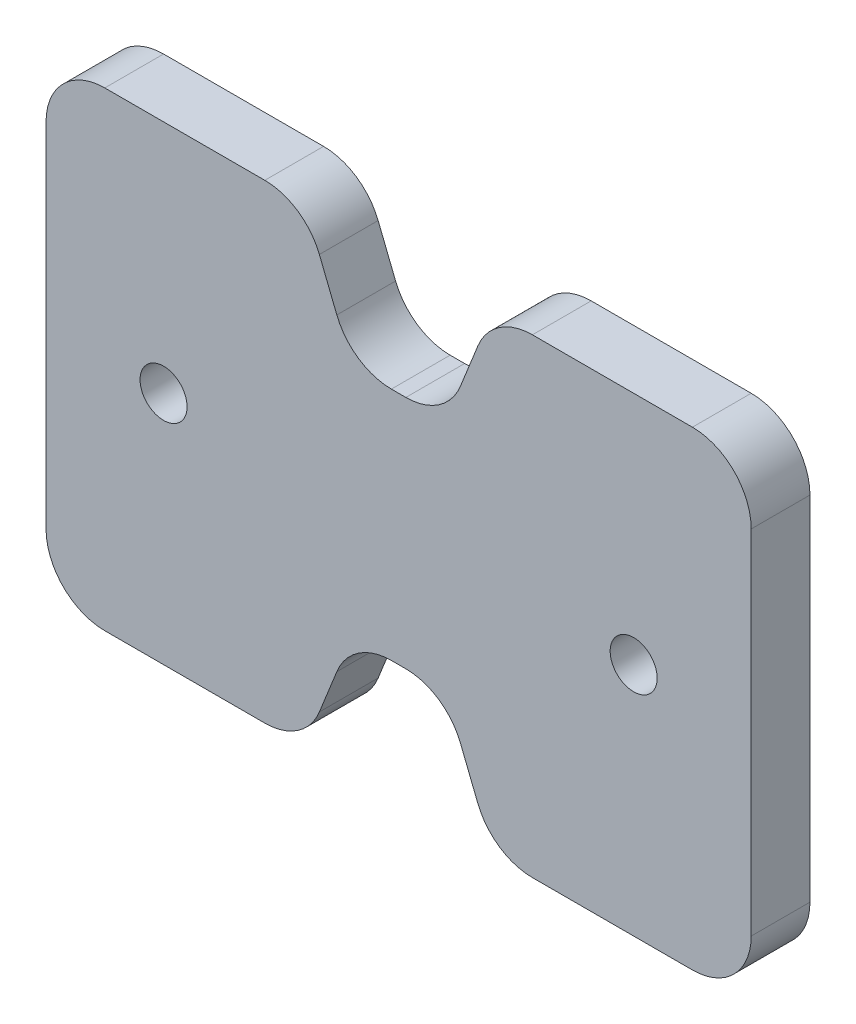
ISO-10303-21;
HEADER;
FILE_DESCRIPTION(('STEP AP214'),'2;1');
FILE_NAME('part.step','',(''),(''),'','','');
FILE_SCHEMA(('AUTOMOTIVE_DESIGN { 1 0 10303 214 1 1 1 1 }'));
ENDSEC;
DATA;
#1=APPLICATION_CONTEXT('core data for automotive mechanical design processes');
#2=APPLICATION_PROTOCOL_DEFINITION('international standard','automotive_design',2000,#1);
#3=PRODUCT_CONTEXT('',#1,'mechanical');
#4=PRODUCT('Part','Part','',(#3));
#5=PRODUCT_RELATED_PRODUCT_CATEGORY('part','',(#4));
#6=PRODUCT_DEFINITION_FORMATION('','',#4);
#7=PRODUCT_DEFINITION_CONTEXT('part definition',#1,'design');
#8=PRODUCT_DEFINITION('design','',#6,#7);
#9=PRODUCT_DEFINITION_SHAPE('','',#8);
#10=(LENGTH_UNIT() NAMED_UNIT(*) SI_UNIT(.MILLI.,.METRE.));
#11=(NAMED_UNIT(*) PLANE_ANGLE_UNIT() SI_UNIT($,.RADIAN.));
#12=(NAMED_UNIT(*) SI_UNIT($,.STERADIAN.) SOLID_ANGLE_UNIT());
#13=UNCERTAINTY_MEASURE_WITH_UNIT(LENGTH_MEASURE(1.E-05),#10,'distance_accuracy_value','');
#14=(GEOMETRIC_REPRESENTATION_CONTEXT(3) GLOBAL_UNCERTAINTY_ASSIGNED_CONTEXT((#13)) GLOBAL_UNIT_ASSIGNED_CONTEXT((#10,
#11,#12)) REPRESENTATION_CONTEXT('',''));
#15=CARTESIAN_POINT('',(0.,0.,0.));
#16=DIRECTION('',(0.,0.,1.));
#17=DIRECTION('',(1.,0.,0.));
#18=AXIS2_PLACEMENT_3D('',#15,#16,#17);
#19=CARTESIAN_POINT('',(0.,0.,5.));
#20=DIRECTION('',(0.,0.,1.));
#21=DIRECTION('',(1.,0.,0.));
#22=AXIS2_PLACEMENT_3D('',#19,#20,#21);
#23=PLANE('',#22);
#24=CARTESIAN_POINT('',(-20.,0.,5.));
#25=DIRECTION('',(0.,0.,1.));
#26=DIRECTION('',(-1.,0.,0.));
#27=AXIS2_PLACEMENT_3D('',#24,#25,#26);
#28=CIRCLE('',#27,2.);
#29=CARTESIAN_POINT('',(-22.,0.,5.));
#30=VERTEX_POINT('',#29);
#31=EDGE_CURVE('E354',#30,#30,#28,.T.);
#32=ORIENTED_EDGE('',*,*,#31,.F.);
#33=EDGE_LOOP('',(#32));
#34=FACE_BOUND('',#33,.T.);
#35=DIRECTION('',(1.,0.,0.));
#36=VECTOR('',#35,1.);
#37=CARTESIAN_POINT('',(8.,-20.,5.));
#38=LINE('',#37,#36);
#39=CARTESIAN_POINT('',(11.3851648071345,-20.,5.));
#40=VERTEX_POINT('',#39);
#41=CARTESIAN_POINT('',(25.,-20.,5.));
#42=VERTEX_POINT('',#41);
#43=EDGE_CURVE('E380',#40,#42,#38,.T.);
#44=ORIENTED_EDGE('',*,*,#43,.T.);
#45=CARTESIAN_POINT('',(25.,-15.,5.));
#46=DIRECTION('',(0.,0.,1.));
#47=DIRECTION('',(1.,0.,0.));
#48=AXIS2_PLACEMENT_3D('',#45,#46,#47);
#49=CIRCLE('',#48,5.);
#50=CARTESIAN_POINT('',(30.,-15.,5.));
#51=VERTEX_POINT('',#50);
#52=EDGE_CURVE('E270',#42,#51,#49,.T.);
#53=ORIENTED_EDGE('',*,*,#52,.T.);
#54=DIRECTION('',(0.,1.,0.));
#55=VECTOR('',#54,1.);
#56=CARTESIAN_POINT('',(30.,-20.,5.));
#57=LINE('',#56,#55);
#58=CARTESIAN_POINT('',(30.,15.,5.));
#59=VERTEX_POINT('',#58);
#60=EDGE_CURVE('E214',#51,#59,#57,.T.);
#61=ORIENTED_EDGE('',*,*,#60,.T.);
#62=CARTESIAN_POINT('',(25.,15.,5.));
#63=DIRECTION('',(0.,0.,1.));
#64=DIRECTION('',(1.,0.,0.));
#65=AXIS2_PLACEMENT_3D('',#62,#63,#64);
#66=CIRCLE('',#65,5.);
#67=CARTESIAN_POINT('',(25.,20.,5.));
#68=VERTEX_POINT('',#67);
#69=EDGE_CURVE('E256',#59,#68,#66,.T.);
#70=ORIENTED_EDGE('',*,*,#69,.T.);
#71=DIRECTION('',(-1.,0.,0.));
#72=VECTOR('',#71,1.);
#73=CARTESIAN_POINT('',(30.,20.,5.));
#74=LINE('',#73,#72);
#75=CARTESIAN_POINT('',(11.3851648071345,20.,5.));
#76=VERTEX_POINT('',#75);
#77=EDGE_CURVE('E385',#68,#76,#74,.T.);
#78=ORIENTED_EDGE('',*,*,#77,.T.);
#79=CARTESIAN_POINT('',(11.3851648071345,15.,5.));
#80=DIRECTION('',(0.,0.,1.));
#81=DIRECTION('',(1.,0.,0.));
#82=AXIS2_PLACEMENT_3D('',#79,#80,#81);
#83=CIRCLE('',#82,5.);
#84=CARTESIAN_POINT('',(6.74278135270821,16.8569533817705,5.));
#85=VERTEX_POINT('',#84);
#86=EDGE_CURVE('E262',#76,#85,#83,.T.);
#87=ORIENTED_EDGE('',*,*,#86,.T.);
#88=DIRECTION('',(-0.371390676354104,-0.928476690885259,0.));
#89=VECTOR('',#88,1.);
#90=CARTESIAN_POINT('',(8.,20.,5.));
#91=LINE('',#90,#89);
#92=CARTESIAN_POINT('',(5.25721864729179,13.1430466182295,5.));
#93=VERTEX_POINT('',#92);
#94=EDGE_CURVE('E346',#85,#93,#91,.T.);
#95=ORIENTED_EDGE('',*,*,#94,.T.);
#96=CARTESIAN_POINT('',(0.614835192865495,15.,5.));
#97=DIRECTION('',(0.,0.,1.));
#98=DIRECTION('',(1.,0.,0.));
#99=AXIS2_PLACEMENT_3D('',#96,#97,#98);
#100=CIRCLE('',#99,5.);
#101=CARTESIAN_POINT('',(0.614835192865495,10.,5.));
#102=VERTEX_POINT('',#101);
#103=EDGE_CURVE('E331',#93,#102,#100,.F.);
#104=ORIENTED_EDGE('',*,*,#103,.T.);
#105=DIRECTION('',(-1.,0.,0.));
#106=VECTOR('',#105,1.);
#107=CARTESIAN_POINT('',(4.,10.,5.));
#108=LINE('',#107,#106);
#109=CARTESIAN_POINT('',(-0.614835192865495,10.,5.));
#110=VERTEX_POINT('',#109);
#111=EDGE_CURVE('E344',#102,#110,#108,.T.);
#112=ORIENTED_EDGE('',*,*,#111,.T.);
#113=CARTESIAN_POINT('',(-0.614835192865495,15.,5.));
#114=DIRECTION('',(0.,0.,1.));
#115=DIRECTION('',(1.,0.,0.));
#116=AXIS2_PLACEMENT_3D('',#113,#114,#115);
#117=CIRCLE('',#116,5.);
#118=CARTESIAN_POINT('',(-5.25721864729179,13.1430466182295,5.));
#119=VERTEX_POINT('',#118);
#120=EDGE_CURVE('E11',#110,#119,#117,.F.);
#121=ORIENTED_EDGE('',*,*,#120,.T.);
#122=DIRECTION('',(-0.371390676354104,0.928476690885259,0.));
#123=VECTOR('',#122,1.);
#124=CARTESIAN_POINT('',(-4.,10.,5.));
#125=LINE('',#124,#123);
#126=CARTESIAN_POINT('',(-6.74278135270821,16.8569533817705,5.));
#127=VERTEX_POINT('',#126);
#128=EDGE_CURVE('E239',#119,#127,#125,.T.);
#129=ORIENTED_EDGE('',*,*,#128,.T.);
#130=CARTESIAN_POINT('',(-11.3851648071345,15.,5.));
#131=DIRECTION('',(0.,0.,1.));
#132=DIRECTION('',(1.,0.,0.));
#133=AXIS2_PLACEMENT_3D('',#130,#131,#132);
#134=CIRCLE('',#133,5.);
#135=CARTESIAN_POINT('',(-11.3851648071345,20.,5.));
#136=VERTEX_POINT('',#135);
#137=EDGE_CURVE('E260',#127,#136,#134,.T.);
#138=ORIENTED_EDGE('',*,*,#137,.T.);
#139=DIRECTION('',(-1.,0.,0.));
#140=VECTOR('',#139,1.);
#141=CARTESIAN_POINT('',(-8.,20.,5.));
#142=LINE('',#141,#140);
#143=CARTESIAN_POINT('',(-25.,20.,5.));
#144=VERTEX_POINT('',#143);
#145=EDGE_CURVE('E238',#136,#144,#142,.T.);
#146=ORIENTED_EDGE('',*,*,#145,.T.);
#147=CARTESIAN_POINT('',(-25.,15.,5.));
#148=DIRECTION('',(0.,0.,1.));
#149=DIRECTION('',(1.,0.,0.));
#150=AXIS2_PLACEMENT_3D('',#147,#148,#149);
#151=CIRCLE('',#150,5.);
#152=CARTESIAN_POINT('',(-30.,15.,5.));
#153=VERTEX_POINT('',#152);
#154=EDGE_CURVE('E258',#144,#153,#151,.T.);
#155=ORIENTED_EDGE('',*,*,#154,.T.);
#156=DIRECTION('',(0.,-1.,0.));
#157=VECTOR('',#156,1.);
#158=CARTESIAN_POINT('',(-30.,20.,5.));
#159=LINE('',#158,#157);
#160=CARTESIAN_POINT('',(-30.,-15.,5.));
#161=VERTEX_POINT('',#160);
#162=EDGE_CURVE('E502',#153,#161,#159,.T.);
#163=ORIENTED_EDGE('',*,*,#162,.T.);
#164=CARTESIAN_POINT('',(-25.,-15.,5.));
#165=DIRECTION('',(0.,0.,1.));
#166=DIRECTION('',(1.,0.,0.));
#167=AXIS2_PLACEMENT_3D('',#164,#165,#166);
#168=CIRCLE('',#167,5.);
#169=CARTESIAN_POINT('',(-25.,-20.,5.));
#170=VERTEX_POINT('',#169);
#171=EDGE_CURVE('E266',#161,#170,#168,.T.);
#172=ORIENTED_EDGE('',*,*,#171,.T.);
#173=DIRECTION('',(1.,0.,0.));
#174=VECTOR('',#173,1.);
#175=CARTESIAN_POINT('',(-30.,-20.,5.));
#176=LINE('',#175,#174);
#177=CARTESIAN_POINT('',(-11.3851648071345,-20.,5.));
#178=VERTEX_POINT('',#177);
#179=EDGE_CURVE('E505',#170,#178,#176,.T.);
#180=ORIENTED_EDGE('',*,*,#179,.T.);
#181=CARTESIAN_POINT('',(-11.3851648071345,-15.,5.));
#182=DIRECTION('',(0.,0.,1.));
#183=DIRECTION('',(1.,0.,0.));
#184=AXIS2_PLACEMENT_3D('',#181,#182,#183);
#185=CIRCLE('',#184,5.);
#186=CARTESIAN_POINT('',(-6.74278135270821,-16.8569533817705,5.));
#187=VERTEX_POINT('',#186);
#188=EDGE_CURVE('E264',#178,#187,#185,.T.);
#189=ORIENTED_EDGE('',*,*,#188,.T.);
#190=DIRECTION('',(0.371390676354104,0.928476690885259,0.));
#191=VECTOR('',#190,1.);
#192=CARTESIAN_POINT('',(-8.,-20.,5.));
#193=LINE('',#192,#191);
#194=CARTESIAN_POINT('',(-5.25721864729179,-13.1430466182295,5.));
#195=VERTEX_POINT('',#194);
#196=EDGE_CURVE('E513',#187,#195,#193,.T.);
#197=ORIENTED_EDGE('',*,*,#196,.T.);
#198=CARTESIAN_POINT('',(-0.614835192865493,-15.,5.));
#199=DIRECTION('',(0.,0.,1.));
#200=DIRECTION('',(1.,0.,0.));
#201=AXIS2_PLACEMENT_3D('',#198,#199,#200);
#202=CIRCLE('',#201,5.);
#203=CARTESIAN_POINT('',(-0.614835192865495,-10.,5.));
#204=VERTEX_POINT('',#203);
#205=EDGE_CURVE('E323',#195,#204,#202,.F.);
#206=ORIENTED_EDGE('',*,*,#205,.T.);
#207=DIRECTION('',(1.,0.,0.));
#208=VECTOR('',#207,1.);
#209=CARTESIAN_POINT('',(-4.,-10.,5.));
#210=LINE('',#209,#208);
#211=CARTESIAN_POINT('',(0.614835192865493,-10.,5.));
#212=VERTEX_POINT('',#211);
#213=EDGE_CURVE('E387',#204,#212,#210,.T.);
#214=ORIENTED_EDGE('',*,*,#213,.T.);
#215=CARTESIAN_POINT('',(0.614835192865494,-15.,5.));
#216=DIRECTION('',(0.,0.,1.));
#217=DIRECTION('',(1.,0.,0.));
#218=AXIS2_PLACEMENT_3D('',#215,#216,#217);
#219=CIRCLE('',#218,5.);
#220=CARTESIAN_POINT('',(5.25721864729179,-13.1430466182295,5.));
#221=VERTEX_POINT('',#220);
#222=EDGE_CURVE('E327',#212,#221,#219,.F.);
#223=ORIENTED_EDGE('',*,*,#222,.T.);
#224=DIRECTION('',(0.371390676354104,-0.928476690885259,0.));
#225=VECTOR('',#224,1.);
#226=CARTESIAN_POINT('',(4.,-10.,5.));
#227=LINE('',#226,#225);
#228=CARTESIAN_POINT('',(6.74278135270821,-16.8569533817705,5.));
#229=VERTEX_POINT('',#228);
#230=EDGE_CURVE('E381',#221,#229,#227,.T.);
#231=ORIENTED_EDGE('',*,*,#230,.T.);
#232=CARTESIAN_POINT('',(11.3851648071345,-15.,5.));
#233=DIRECTION('',(0.,0.,1.));
#234=DIRECTION('',(1.,0.,0.));
#235=AXIS2_PLACEMENT_3D('',#232,#233,#234);
#236=CIRCLE('',#235,5.);
#237=EDGE_CURVE('E268',#229,#40,#236,.T.);
#238=ORIENTED_EDGE('',*,*,#237,.T.);
#239=EDGE_LOOP('',(#44,#53,#61,#70,#78,#87,#95,#104,#112,#121,#129,#138,#146,#155,#163,#172,
#180,#189,#197,#206,#214,#223,#231,#238));
#240=FACE_BOUND('',#239,.T.);
#241=CARTESIAN_POINT('',(20.,0.,5.));
#242=DIRECTION('',(0.,0.,1.));
#243=DIRECTION('',(1.,0.,0.));
#244=AXIS2_PLACEMENT_3D('',#241,#242,#243);
#245=CIRCLE('',#244,2.);
#246=CARTESIAN_POINT('',(22.,0.,5.));
#247=VERTEX_POINT('',#246);
#248=EDGE_CURVE('E537',#247,#247,#245,.T.);
#249=ORIENTED_EDGE('',*,*,#248,.F.);
#250=EDGE_LOOP('',(#249));
#251=FACE_BOUND('',#250,.T.);
#252=ADVANCED_FACE('F33',(#34,#240,#251),#23,.T.);
#253=CARTESIAN_POINT('',(0.,0.,0.));
#254=DIRECTION('',(0.,0.,1.));
#255=DIRECTION('',(1.,0.,0.));
#256=AXIS2_PLACEMENT_3D('',#253,#254,#255);
#257=PLANE('',#256);
#258=DIRECTION('',(0.,1.,0.));
#259=VECTOR('',#258,1.);
#260=CARTESIAN_POINT('',(30.,-20.,0.));
#261=LINE('',#260,#259);
#262=CARTESIAN_POINT('',(30.,-15.,0.));
#263=VERTEX_POINT('',#262);
#264=CARTESIAN_POINT('',(30.,15.,0.));
#265=VERTEX_POINT('',#264);
#266=EDGE_CURVE('E211',#263,#265,#261,.T.);
#267=ORIENTED_EDGE('',*,*,#266,.F.);
#268=CARTESIAN_POINT('',(25.,-15.,0.));
#269=DIRECTION('',(0.,0.,1.));
#270=DIRECTION('',(1.,0.,0.));
#271=AXIS2_PLACEMENT_3D('',#268,#269,#270);
#272=CIRCLE('',#271,5.);
#273=CARTESIAN_POINT('',(25.,-20.,0.));
#274=VERTEX_POINT('',#273);
#275=EDGE_CURVE('E194',#263,#274,#272,.F.);
#276=ORIENTED_EDGE('',*,*,#275,.T.);
#277=DIRECTION('',(1.,0.,0.));
#278=VECTOR('',#277,1.);
#279=CARTESIAN_POINT('',(8.,-20.,0.));
#280=LINE('',#279,#278);
#281=CARTESIAN_POINT('',(11.3851648071345,-20.,0.));
#282=VERTEX_POINT('',#281);
#283=EDGE_CURVE('E222',#282,#274,#280,.T.);
#284=ORIENTED_EDGE('',*,*,#283,.F.);
#285=CARTESIAN_POINT('',(11.3851648071345,-15.,0.));
#286=DIRECTION('',(0.,0.,1.));
#287=DIRECTION('',(1.,0.,0.));
#288=AXIS2_PLACEMENT_3D('',#285,#286,#287);
#289=CIRCLE('',#288,5.);
#290=CARTESIAN_POINT('',(6.74278135270821,-16.8569533817705,0.));
#291=VERTEX_POINT('',#290);
#292=EDGE_CURVE('E205',#282,#291,#289,.F.);
#293=ORIENTED_EDGE('',*,*,#292,.T.);
#294=DIRECTION('',(0.371390676354104,-0.928476690885259,0.));
#295=VECTOR('',#294,1.);
#296=CARTESIAN_POINT('',(4.,-10.,0.));
#297=LINE('',#296,#295);
#298=CARTESIAN_POINT('',(5.25721864729179,-13.1430466182295,0.));
#299=VERTEX_POINT('',#298);
#300=EDGE_CURVE('E227',#299,#291,#297,.T.);
#301=ORIENTED_EDGE('',*,*,#300,.F.);
#302=CARTESIAN_POINT('',(0.614835192865494,-15.,0.));
#303=DIRECTION('',(0.,0.,1.));
#304=DIRECTION('',(1.,0.,0.));
#305=AXIS2_PLACEMENT_3D('',#302,#303,#304);
#306=CIRCLE('',#305,5.);
#307=CARTESIAN_POINT('',(0.614835192865493,-10.,0.));
#308=VERTEX_POINT('',#307);
#309=EDGE_CURVE('E325',#299,#308,#306,.T.);
#310=ORIENTED_EDGE('',*,*,#309,.T.);
#311=DIRECTION('',(1.,0.,0.));
#312=VECTOR('',#311,1.);
#313=CARTESIAN_POINT('',(-4.,-10.,0.));
#314=LINE('',#313,#312);
#315=CARTESIAN_POINT('',(-0.614835192865495,-10.,0.));
#316=VERTEX_POINT('',#315);
#317=EDGE_CURVE('E363',#316,#308,#314,.T.);
#318=ORIENTED_EDGE('',*,*,#317,.F.);
#319=CARTESIAN_POINT('',(-0.614835192865493,-15.,0.));
#320=DIRECTION('',(0.,0.,1.));
#321=DIRECTION('',(1.,0.,0.));
#322=AXIS2_PLACEMENT_3D('',#319,#320,#321);
#323=CIRCLE('',#322,5.);
#324=CARTESIAN_POINT('',(-5.25721864729179,-13.1430466182295,0.));
#325=VERTEX_POINT('',#324);
#326=EDGE_CURVE('E321',#316,#325,#323,.T.);
#327=ORIENTED_EDGE('',*,*,#326,.T.);
#328=DIRECTION('',(0.371390676354104,0.928476690885259,0.));
#329=VECTOR('',#328,1.);
#330=CARTESIAN_POINT('',(-8.,-20.,0.));
#331=LINE('',#330,#329);
#332=CARTESIAN_POINT('',(-6.74278135270821,-16.8569533817705,0.));
#333=VERTEX_POINT('',#332);
#334=EDGE_CURVE('E360',#333,#325,#331,.T.);
#335=ORIENTED_EDGE('',*,*,#334,.F.);
#336=CARTESIAN_POINT('',(-11.3851648071345,-15.,0.));
#337=DIRECTION('',(0.,0.,1.));
#338=DIRECTION('',(1.,0.,0.));
#339=AXIS2_PLACEMENT_3D('',#336,#337,#338);
#340=CIRCLE('',#339,5.);
#341=CARTESIAN_POINT('',(-11.3851648071345,-20.,0.));
#342=VERTEX_POINT('',#341);
#343=EDGE_CURVE('E248',#333,#342,#340,.F.);
#344=ORIENTED_EDGE('',*,*,#343,.T.);
#345=DIRECTION('',(1.,0.,0.));
#346=VECTOR('',#345,1.);
#347=CARTESIAN_POINT('',(-30.,-20.,0.));
#348=LINE('',#347,#346);
#349=CARTESIAN_POINT('',(-25.,-20.,0.));
#350=VERTEX_POINT('',#349);
#351=EDGE_CURVE('E357',#350,#342,#348,.T.);
#352=ORIENTED_EDGE('',*,*,#351,.F.);
#353=CARTESIAN_POINT('',(-25.,-15.,0.));
#354=DIRECTION('',(0.,0.,1.));
#355=DIRECTION('',(1.,0.,0.));
#356=AXIS2_PLACEMENT_3D('',#353,#354,#355);
#357=CIRCLE('',#356,5.);
#358=CARTESIAN_POINT('',(-30.,-15.,0.));
#359=VERTEX_POINT('',#358);
#360=EDGE_CURVE('E250',#350,#359,#357,.F.);
#361=ORIENTED_EDGE('',*,*,#360,.T.);
#362=DIRECTION('',(0.,-1.,0.));
#363=VECTOR('',#362,1.);
#364=CARTESIAN_POINT('',(-30.,20.,0.));
#365=LINE('',#364,#363);
#366=CARTESIAN_POINT('',(-30.,15.,0.));
#367=VERTEX_POINT('',#366);
#368=EDGE_CURVE('E353',#367,#359,#365,.T.);
#369=ORIENTED_EDGE('',*,*,#368,.F.);
#370=CARTESIAN_POINT('',(-25.,15.,0.));
#371=DIRECTION('',(0.,0.,1.));
#372=DIRECTION('',(1.,0.,0.));
#373=AXIS2_PLACEMENT_3D('',#370,#371,#372);
#374=CIRCLE('',#373,5.);
#375=CARTESIAN_POINT('',(-25.,20.,0.));
#376=VERTEX_POINT('',#375);
#377=EDGE_CURVE('E242',#367,#376,#374,.F.);
#378=ORIENTED_EDGE('',*,*,#377,.T.);
#379=DIRECTION('',(-1.,0.,0.));
#380=VECTOR('',#379,1.);
#381=CARTESIAN_POINT('',(-8.,20.,0.));
#382=LINE('',#381,#380);
#383=CARTESIAN_POINT('',(-11.3851648071345,20.,0.));
#384=VERTEX_POINT('',#383);
#385=EDGE_CURVE('E350',#384,#376,#382,.T.);
#386=ORIENTED_EDGE('',*,*,#385,.F.);
#387=CARTESIAN_POINT('',(-11.3851648071345,15.,0.));
#388=DIRECTION('',(0.,0.,1.));
#389=DIRECTION('',(1.,0.,0.));
#390=AXIS2_PLACEMENT_3D('',#387,#388,#389);
#391=CIRCLE('',#390,5.);
#392=CARTESIAN_POINT('',(-6.74278135270821,16.8569533817705,0.));
#393=VERTEX_POINT('',#392);
#394=EDGE_CURVE('E244',#384,#393,#391,.F.);
#395=ORIENTED_EDGE('',*,*,#394,.T.);
#396=DIRECTION('',(-0.371390676354104,0.928476690885259,0.));
#397=VECTOR('',#396,1.);
#398=CARTESIAN_POINT('',(-4.,10.,0.));
#399=LINE('',#398,#397);
#400=CARTESIAN_POINT('',(-5.25721864729179,13.1430466182295,0.));
#401=VERTEX_POINT('',#400);
#402=EDGE_CURVE('E236',#401,#393,#399,.T.);
#403=ORIENTED_EDGE('',*,*,#402,.F.);
#404=CARTESIAN_POINT('',(-0.614835192865495,15.,0.));
#405=DIRECTION('',(0.,0.,1.));
#406=DIRECTION('',(1.,0.,0.));
#407=AXIS2_PLACEMENT_3D('',#404,#405,#406);
#408=CIRCLE('',#407,5.);
#409=CARTESIAN_POINT('',(-0.614835192865495,10.,0.));
#410=VERTEX_POINT('',#409);
#411=EDGE_CURVE('E41',#401,#410,#408,.T.);
#412=ORIENTED_EDGE('',*,*,#411,.T.);
#413=DIRECTION('',(-1.,0.,0.));
#414=VECTOR('',#413,1.);
#415=CARTESIAN_POINT('',(4.,10.,0.));
#416=LINE('',#415,#414);
#417=CARTESIAN_POINT('',(0.614835192865495,10.,0.));
#418=VERTEX_POINT('',#417);
#419=EDGE_CURVE('E233',#418,#410,#416,.T.);
#420=ORIENTED_EDGE('',*,*,#419,.F.);
#421=CARTESIAN_POINT('',(0.614835192865495,15.,0.));
#422=DIRECTION('',(0.,0.,1.));
#423=DIRECTION('',(1.,0.,0.));
#424=AXIS2_PLACEMENT_3D('',#421,#422,#423);
#425=CIRCLE('',#424,5.);
#426=CARTESIAN_POINT('',(5.25721864729179,13.1430466182295,0.));
#427=VERTEX_POINT('',#426);
#428=EDGE_CURVE('E329',#418,#427,#425,.T.);
#429=ORIENTED_EDGE('',*,*,#428,.T.);
#430=DIRECTION('',(-0.371390676354104,-0.928476690885259,0.));
#431=VECTOR('',#430,1.);
#432=CARTESIAN_POINT('',(8.,20.,0.));
#433=LINE('',#432,#431);
#434=CARTESIAN_POINT('',(6.74278135270821,16.8569533817705,0.));
#435=VERTEX_POINT('',#434);
#436=EDGE_CURVE('E225',#435,#427,#433,.T.);
#437=ORIENTED_EDGE('',*,*,#436,.F.);
#438=CARTESIAN_POINT('',(11.3851648071345,15.,0.));
#439=DIRECTION('',(0.,0.,1.));
#440=DIRECTION('',(1.,0.,0.));
#441=AXIS2_PLACEMENT_3D('',#438,#439,#440);
#442=CIRCLE('',#441,5.);
#443=CARTESIAN_POINT('',(11.3851648071345,20.,0.));
#444=VERTEX_POINT('',#443);
#445=EDGE_CURVE('E246',#435,#444,#442,.F.);
#446=ORIENTED_EDGE('',*,*,#445,.T.);
#447=DIRECTION('',(-1.,0.,0.));
#448=VECTOR('',#447,1.);
#449=CARTESIAN_POINT('',(30.,20.,0.));
#450=LINE('',#449,#448);
#451=CARTESIAN_POINT('',(25.,20.,0.));
#452=VERTEX_POINT('',#451);
#453=EDGE_CURVE('E221',#452,#444,#450,.T.);
#454=ORIENTED_EDGE('',*,*,#453,.F.);
#455=CARTESIAN_POINT('',(25.,15.,0.));
#456=DIRECTION('',(0.,0.,1.));
#457=DIRECTION('',(1.,0.,0.));
#458=AXIS2_PLACEMENT_3D('',#455,#456,#457);
#459=CIRCLE('',#458,5.);
#460=EDGE_CURVE('E215',#452,#265,#459,.F.);
#461=ORIENTED_EDGE('',*,*,#460,.T.);
#462=EDGE_LOOP('',(#267,#276,#284,#293,#301,#310,#318,#327,#335,#344,#352,#361,#369,#378,#386,
#395,#403,#412,#420,#429,#437,#446,#454,#461));
#463=FACE_BOUND('',#462,.T.);
#464=CARTESIAN_POINT('',(-20.,0.,0.));
#465=DIRECTION('',(0.,0.,1.));
#466=DIRECTION('',(-1.,0.,0.));
#467=AXIS2_PLACEMENT_3D('',#464,#465,#466);
#468=CIRCLE('',#467,2.);
#469=CARTESIAN_POINT('',(-22.,0.,0.));
#470=VERTEX_POINT('',#469);
#471=EDGE_CURVE('E508',#470,#470,#468,.T.);
#472=ORIENTED_EDGE('',*,*,#471,.T.);
#473=EDGE_LOOP('',(#472));
#474=FACE_BOUND('',#473,.T.);
#475=CARTESIAN_POINT('',(20.,0.,0.));
#476=DIRECTION('',(0.,0.,1.));
#477=DIRECTION('',(1.,0.,0.));
#478=AXIS2_PLACEMENT_3D('',#475,#476,#477);
#479=CIRCLE('',#478,2.);
#480=CARTESIAN_POINT('',(22.,0.,0.));
#481=VERTEX_POINT('',#480);
#482=EDGE_CURVE('E540',#481,#481,#479,.T.);
#483=ORIENTED_EDGE('',*,*,#482,.T.);
#484=EDGE_LOOP('',(#483));
#485=FACE_BOUND('',#484,.T.);
#486=ADVANCED_FACE('F218',(#463,#474,#485),#257,.F.);
#487=CARTESIAN_POINT('',(-8.,20.,5.));
#488=DIRECTION('',(0.,-1.,0.));
#489=DIRECTION('',(0.,0.,-1.));
#490=AXIS2_PLACEMENT_3D('',#487,#488,#489);
#491=PLANE('',#490);
#492=ORIENTED_EDGE('',*,*,#145,.F.);
#493=DIRECTION('',(0.,0.,-1.));
#494=VECTOR('',#493,1.);
#495=CARTESIAN_POINT('',(-11.3851648071345,20.,5.));
#496=LINE('',#495,#494);
#497=EDGE_CURVE('E318',#136,#384,#496,.T.);
#498=ORIENTED_EDGE('',*,*,#497,.T.);
#499=ORIENTED_EDGE('',*,*,#385,.T.);
#500=DIRECTION('',(0.,0.,-1.));
#501=VECTOR('',#500,1.);
#502=CARTESIAN_POINT('',(-25.,20.,5.));
#503=LINE('',#502,#501);
#504=EDGE_CURVE('E316',#376,#144,#503,.F.);
#505=ORIENTED_EDGE('',*,*,#504,.T.);
#506=EDGE_LOOP('',(#492,#498,#499,#505));
#507=FACE_BOUND('',#506,.T.);
#508=ADVANCED_FACE('F425',(#507),#491,.F.);
#509=CARTESIAN_POINT('',(-30.,20.,5.));
#510=DIRECTION('',(1.,0.,0.));
#511=DIRECTION('',(0.,0.,-1.));
#512=AXIS2_PLACEMENT_3D('',#509,#510,#511);
#513=PLANE('',#512);
#514=ORIENTED_EDGE('',*,*,#368,.T.);
#515=DIRECTION('',(0.,0.,-1.));
#516=VECTOR('',#515,1.);
#517=CARTESIAN_POINT('',(-30.,-15.,5.));
#518=LINE('',#517,#516);
#519=EDGE_CURVE('E285',#359,#161,#518,.F.);
#520=ORIENTED_EDGE('',*,*,#519,.T.);
#521=ORIENTED_EDGE('',*,*,#162,.F.);
#522=DIRECTION('',(0.,0.,-1.));
#523=VECTOR('',#522,1.);
#524=CARTESIAN_POINT('',(-30.,15.,5.));
#525=LINE('',#524,#523);
#526=EDGE_CURVE('E282',#153,#367,#525,.T.);
#527=ORIENTED_EDGE('',*,*,#526,.T.);
#528=EDGE_LOOP('',(#514,#520,#521,#527));
#529=FACE_BOUND('',#528,.T.);
#530=ADVANCED_FACE('F457',(#529),#513,.F.);
#531=CARTESIAN_POINT('',(-30.,-20.,5.));
#532=DIRECTION('',(0.,1.,0.));
#533=DIRECTION('',(0.,0.,1.));
#534=AXIS2_PLACEMENT_3D('',#531,#532,#533);
#535=PLANE('',#534);
#536=ORIENTED_EDGE('',*,*,#179,.F.);
#537=DIRECTION('',(0.,0.,-1.));
#538=VECTOR('',#537,1.);
#539=CARTESIAN_POINT('',(-25.,-20.,5.));
#540=LINE('',#539,#538);
#541=EDGE_CURVE('E279',#170,#350,#540,.T.);
#542=ORIENTED_EDGE('',*,*,#541,.T.);
#543=ORIENTED_EDGE('',*,*,#351,.T.);
#544=DIRECTION('',(0.,0.,-1.));
#545=VECTOR('',#544,1.);
#546=CARTESIAN_POINT('',(-11.3851648071345,-20.,5.));
#547=LINE('',#546,#545);
#548=EDGE_CURVE('E277',#342,#178,#547,.F.);
#549=ORIENTED_EDGE('',*,*,#548,.T.);
#550=EDGE_LOOP('',(#536,#542,#543,#549));
#551=FACE_BOUND('',#550,.T.);
#552=ADVANCED_FACE('F453',(#551),#535,.F.);
#553=CARTESIAN_POINT('',(-8.,-20.,5.));
#554=DIRECTION('',(-0.928476690885259,0.371390676354104,0.));
#555=DIRECTION('',(-0.371390676354104,-0.928476690885259,0.));
#556=AXIS2_PLACEMENT_3D('',#553,#554,#555);
#557=PLANE('',#556);
#558=ORIENTED_EDGE('',*,*,#196,.F.);
#559=DIRECTION('',(0.,0.,-1.));
#560=VECTOR('',#559,1.);
#561=CARTESIAN_POINT('',(-6.74278135270821,-16.8569533817705,5.));
#562=LINE('',#561,#560);
#563=EDGE_CURVE('E289',#187,#333,#562,.T.);
#564=ORIENTED_EDGE('',*,*,#563,.T.);
#565=ORIENTED_EDGE('',*,*,#334,.T.);
#566=DIRECTION('',(0.,0.,-1.));
#567=VECTOR('',#566,1.);
#568=CARTESIAN_POINT('',(-5.25721864729179,-13.1430466182295,5.));
#569=LINE('',#568,#567);
#570=EDGE_CURVE('E287',#325,#195,#569,.F.);
#571=ORIENTED_EDGE('',*,*,#570,.T.);
#572=EDGE_LOOP('',(#558,#564,#565,#571));
#573=FACE_BOUND('',#572,.T.);
#574=ADVANCED_FACE('F449',(#573),#557,.F.);
#575=CARTESIAN_POINT('',(-4.,-10.,5.));
#576=DIRECTION('',(0.,1.,0.));
#577=DIRECTION('',(-1.,0.,0.));
#578=AXIS2_PLACEMENT_3D('',#575,#576,#577);
#579=PLANE('',#578);
#580=ORIENTED_EDGE('',*,*,#213,.F.);
#581=DIRECTION('',(0.,0.,-1.));
#582=VECTOR('',#581,1.);
#583=CARTESIAN_POINT('',(-0.614835192865494,-10.,0.));
#584=LINE('',#583,#582);
#585=EDGE_CURVE('E294',#204,#316,#584,.T.);
#586=ORIENTED_EDGE('',*,*,#585,.T.);
#587=ORIENTED_EDGE('',*,*,#317,.T.);
#588=DIRECTION('',(0.,0.,-1.));
#589=VECTOR('',#588,1.);
#590=CARTESIAN_POINT('',(0.614835192865493,-10.,5.));
#591=LINE('',#590,#589);
#592=EDGE_CURVE('E292',#308,#212,#591,.F.);
#593=ORIENTED_EDGE('',*,*,#592,.T.);
#594=EDGE_LOOP('',(#580,#586,#587,#593));
#595=FACE_BOUND('',#594,.T.);
#596=ADVANCED_FACE('F446',(#595),#579,.F.);
#597=CARTESIAN_POINT('',(4.,-10.,5.));
#598=DIRECTION('',(0.928476690885259,0.371390676354104,0.));
#599=DIRECTION('',(-0.371390676354104,0.928476690885259,0.));
#600=AXIS2_PLACEMENT_3D('',#597,#598,#599);
#601=PLANE('',#600);
#602=ORIENTED_EDGE('',*,*,#300,.T.);
#603=DIRECTION('',(0.,0.,-1.));
#604=VECTOR('',#603,1.);
#605=CARTESIAN_POINT('',(6.74278135270821,-16.8569533817705,5.));
#606=LINE('',#605,#604);
#607=EDGE_CURVE('E275',#291,#229,#606,.F.);
#608=ORIENTED_EDGE('',*,*,#607,.T.);
#609=ORIENTED_EDGE('',*,*,#230,.F.);
#610=DIRECTION('',(0.,0.,-1.));
#611=VECTOR('',#610,1.);
#612=CARTESIAN_POINT('',(5.25721864729179,-13.1430466182295,0.));
#613=LINE('',#612,#611);
#614=EDGE_CURVE('E272',#221,#299,#613,.T.);
#615=ORIENTED_EDGE('',*,*,#614,.T.);
#616=EDGE_LOOP('',(#602,#608,#609,#615));
#617=FACE_BOUND('',#616,.T.);
#618=ADVANCED_FACE('F369',(#617),#601,.F.);
#619=CARTESIAN_POINT('',(8.,-20.,5.));
#620=DIRECTION('',(0.,1.,0.));
#621=DIRECTION('',(0.,0.,1.));
#622=AXIS2_PLACEMENT_3D('',#619,#620,#621);
#623=PLANE('',#622);
#624=ORIENTED_EDGE('',*,*,#283,.T.);
#625=DIRECTION('',(0.,0.,-1.));
#626=VECTOR('',#625,1.);
#627=CARTESIAN_POINT('',(25.,-20.,5.));
#628=LINE('',#627,#626);
#629=EDGE_CURVE('E199',#274,#42,#628,.F.);
#630=ORIENTED_EDGE('',*,*,#629,.T.);
#631=ORIENTED_EDGE('',*,*,#43,.F.);
#632=DIRECTION('',(0.,0.,-1.));
#633=VECTOR('',#632,1.);
#634=CARTESIAN_POINT('',(11.3851648071345,-20.,5.));
#635=LINE('',#634,#633);
#636=EDGE_CURVE('E204',#40,#282,#635,.T.);
#637=ORIENTED_EDGE('',*,*,#636,.T.);
#638=EDGE_LOOP('',(#624,#630,#631,#637));
#639=FACE_BOUND('',#638,.T.);
#640=ADVANCED_FACE('F383',(#639),#623,.F.);
#641=CARTESIAN_POINT('',(30.,-20.,5.));
#642=DIRECTION('',(-1.,0.,0.));
#643=DIRECTION('',(0.,0.,1.));
#644=AXIS2_PLACEMENT_3D('',#641,#642,#643);
#645=PLANE('',#644);
#646=ORIENTED_EDGE('',*,*,#60,.F.);
#647=DIRECTION('',(0.,0.,-1.));
#648=VECTOR('',#647,1.);
#649=CARTESIAN_POINT('',(30.,-15.,5.));
#650=LINE('',#649,#648);
#651=EDGE_CURVE('E198',#51,#263,#650,.T.);
#652=ORIENTED_EDGE('',*,*,#651,.T.);
#653=ORIENTED_EDGE('',*,*,#266,.T.);
#654=DIRECTION('',(0.,0.,-1.));
#655=VECTOR('',#654,1.);
#656=CARTESIAN_POINT('',(30.,15.,5.));
#657=LINE('',#656,#655);
#658=EDGE_CURVE('E216',#265,#59,#657,.F.);
#659=ORIENTED_EDGE('',*,*,#658,.T.);
#660=EDGE_LOOP('',(#646,#652,#653,#659));
#661=FACE_BOUND('',#660,.T.);
#662=ADVANCED_FACE('F210',(#661),#645,.F.);
#663=CARTESIAN_POINT('',(30.,20.,5.));
#664=DIRECTION('',(0.,-1.,0.));
#665=DIRECTION('',(0.,0.,-1.));
#666=AXIS2_PLACEMENT_3D('',#663,#664,#665);
#667=PLANE('',#666);
#668=ORIENTED_EDGE('',*,*,#453,.T.);
#669=DIRECTION('',(0.,0.,-1.));
#670=VECTOR('',#669,1.);
#671=CARTESIAN_POINT('',(11.3851648071345,20.,5.));
#672=LINE('',#671,#670);
#673=EDGE_CURVE('E305',#444,#76,#672,.F.);
#674=ORIENTED_EDGE('',*,*,#673,.T.);
#675=ORIENTED_EDGE('',*,*,#77,.F.);
#676=DIRECTION('',(0.,0.,-1.));
#677=VECTOR('',#676,1.);
#678=CARTESIAN_POINT('',(25.,20.,5.));
#679=LINE('',#678,#677);
#680=EDGE_CURVE('E302',#68,#452,#679,.T.);
#681=ORIENTED_EDGE('',*,*,#680,.T.);
#682=EDGE_LOOP('',(#668,#674,#675,#681));
#683=FACE_BOUND('',#682,.T.);
#684=ADVANCED_FACE('F407',(#683),#667,.F.);
#685=CARTESIAN_POINT('',(8.,20.,5.));
#686=DIRECTION('',(0.928476690885259,-0.371390676354104,0.));
#687=DIRECTION('',(0.371390676354104,0.928476690885259,0.));
#688=AXIS2_PLACEMENT_3D('',#685,#686,#687);
#689=PLANE('',#688);
#690=ORIENTED_EDGE('',*,*,#94,.F.);
#691=DIRECTION('',(0.,0.,-1.));
#692=VECTOR('',#691,1.);
#693=CARTESIAN_POINT('',(6.74278135270821,16.8569533817705,5.));
#694=LINE('',#693,#692);
#695=EDGE_CURVE('E299',#85,#435,#694,.T.);
#696=ORIENTED_EDGE('',*,*,#695,.T.);
#697=ORIENTED_EDGE('',*,*,#436,.T.);
#698=DIRECTION('',(0.,0.,-1.));
#699=VECTOR('',#698,1.);
#700=CARTESIAN_POINT('',(5.25721864729179,13.1430466182295,5.));
#701=LINE('',#700,#699);
#702=EDGE_CURVE('E297',#427,#93,#701,.F.);
#703=ORIENTED_EDGE('',*,*,#702,.T.);
#704=EDGE_LOOP('',(#690,#696,#697,#703));
#705=FACE_BOUND('',#704,.T.);
#706=ADVANCED_FACE('F402',(#705),#689,.F.);
#707=CARTESIAN_POINT('',(4.,10.,5.));
#708=DIRECTION('',(0.,-1.,0.));
#709=DIRECTION('',(0.,0.,-1.));
#710=AXIS2_PLACEMENT_3D('',#707,#708,#709);
#711=PLANE('',#710);
#712=ORIENTED_EDGE('',*,*,#111,.F.);
#713=DIRECTION('',(0.,0.,-1.));
#714=VECTOR('',#713,1.);
#715=CARTESIAN_POINT('',(0.614835192865495,10.,0.));
#716=LINE('',#715,#714);
#717=EDGE_CURVE('E309',#102,#418,#716,.T.);
#718=ORIENTED_EDGE('',*,*,#717,.T.);
#719=ORIENTED_EDGE('',*,*,#419,.T.);
#720=DIRECTION('',(0.,0.,-1.));
#721=VECTOR('',#720,1.);
#722=CARTESIAN_POINT('',(-0.614835192865495,10.,5.));
#723=LINE('',#722,#721);
#724=EDGE_CURVE('E307',#410,#110,#723,.F.);
#725=ORIENTED_EDGE('',*,*,#724,.T.);
#726=EDGE_LOOP('',(#712,#718,#719,#725));
#727=FACE_BOUND('',#726,.T.);
#728=ADVANCED_FACE('F339',(#727),#711,.F.);
#729=CARTESIAN_POINT('',(-4.,10.,5.));
#730=DIRECTION('',(-0.928476690885259,-0.371390676354104,0.));
#731=DIRECTION('',(0.371390676354104,-0.928476690885259,0.));
#732=AXIS2_PLACEMENT_3D('',#729,#730,#731);
#733=PLANE('',#732);
#734=ORIENTED_EDGE('',*,*,#128,.F.);
#735=DIRECTION('',(0.,0.,-1.));
#736=VECTOR('',#735,1.);
#737=CARTESIAN_POINT('',(-5.25721864729179,13.1430466182295,0.));
#738=LINE('',#737,#736);
#739=EDGE_CURVE('E313',#119,#401,#738,.T.);
#740=ORIENTED_EDGE('',*,*,#739,.T.);
#741=ORIENTED_EDGE('',*,*,#402,.T.);
#742=DIRECTION('',(0.,0.,-1.));
#743=VECTOR('',#742,1.);
#744=CARTESIAN_POINT('',(-6.74278135270821,16.8569533817705,5.));
#745=LINE('',#744,#743);
#746=EDGE_CURVE('E48',#393,#127,#745,.F.);
#747=ORIENTED_EDGE('',*,*,#746,.T.);
#748=EDGE_LOOP('',(#734,#740,#741,#747));
#749=FACE_BOUND('',#748,.T.);
#750=ADVANCED_FACE('F342',(#749),#733,.F.);
#751=CARTESIAN_POINT('',(-20.,0.,5.));
#752=DIRECTION('',(0.,0.,-1.));
#753=DIRECTION('',(-1.,0.,0.));
#754=AXIS2_PLACEMENT_3D('',#751,#752,#753);
#755=CYLINDRICAL_SURFACE('',#754,2.);
#756=ORIENTED_EDGE('',*,*,#31,.T.);
#757=EDGE_LOOP('',(#756));
#758=FACE_BOUND('',#757,.T.);
#759=ORIENTED_EDGE('',*,*,#471,.F.);
#760=EDGE_LOOP('',(#759));
#761=FACE_BOUND('',#760,.T.);
#762=ADVANCED_FACE('F429',(#758,#761),#755,.F.);
#763=CARTESIAN_POINT('',(20.,0.,5.));
#764=DIRECTION('',(0.,0.,-1.));
#765=DIRECTION('',(-1.,0.,0.));
#766=AXIS2_PLACEMENT_3D('',#763,#764,#765);
#767=CYLINDRICAL_SURFACE('',#766,2.);
#768=ORIENTED_EDGE('',*,*,#248,.T.);
#769=EDGE_LOOP('',(#768));
#770=FACE_BOUND('',#769,.T.);
#771=ORIENTED_EDGE('',*,*,#482,.F.);
#772=EDGE_LOOP('',(#771));
#773=FACE_BOUND('',#772,.T.);
#774=ADVANCED_FACE('F467',(#770,#773),#767,.F.);
#775=CARTESIAN_POINT('',(25.,-15.,5.));
#776=DIRECTION('',(0.,0.,-1.));
#777=DIRECTION('',(-1.,0.,0.));
#778=AXIS2_PLACEMENT_3D('',#775,#776,#777);
#779=CYLINDRICAL_SURFACE('',#778,5.);
#780=ORIENTED_EDGE('',*,*,#52,.F.);
#781=ORIENTED_EDGE('',*,*,#629,.F.);
#782=ORIENTED_EDGE('',*,*,#275,.F.);
#783=ORIENTED_EDGE('',*,*,#651,.F.);
#784=EDGE_LOOP('',(#780,#781,#782,#783));
#785=FACE_BOUND('',#784,.T.);
#786=ADVANCED_FACE('F197',(#785),#779,.T.);
#787=CARTESIAN_POINT('',(11.3851648071345,-15.,5.));
#788=DIRECTION('',(0.,0.,-1.));
#789=DIRECTION('',(-1.,0.,0.));
#790=AXIS2_PLACEMENT_3D('',#787,#788,#789);
#791=CYLINDRICAL_SURFACE('',#790,5.);
#792=ORIENTED_EDGE('',*,*,#237,.F.);
#793=ORIENTED_EDGE('',*,*,#607,.F.);
#794=ORIENTED_EDGE('',*,*,#292,.F.);
#795=ORIENTED_EDGE('',*,*,#636,.F.);
#796=EDGE_LOOP('',(#792,#793,#794,#795));
#797=FACE_BOUND('',#796,.T.);
#798=ADVANCED_FACE('F375',(#797),#791,.T.);
#799=CARTESIAN_POINT('',(-25.,-15.,5.));
#800=DIRECTION('',(0.,0.,-1.));
#801=DIRECTION('',(-1.,0.,0.));
#802=AXIS2_PLACEMENT_3D('',#799,#800,#801);
#803=CYLINDRICAL_SURFACE('',#802,5.);
#804=ORIENTED_EDGE('',*,*,#171,.F.);
#805=ORIENTED_EDGE('',*,*,#519,.F.);
#806=ORIENTED_EDGE('',*,*,#360,.F.);
#807=ORIENTED_EDGE('',*,*,#541,.F.);
#808=EDGE_LOOP('',(#804,#805,#806,#807));
#809=FACE_BOUND('',#808,.T.);
#810=ADVANCED_FACE('F470',(#809),#803,.T.);
#811=CARTESIAN_POINT('',(-11.3851648071345,-15.,5.));
#812=DIRECTION('',(0.,0.,-1.));
#813=DIRECTION('',(-1.,0.,0.));
#814=AXIS2_PLACEMENT_3D('',#811,#812,#813);
#815=CYLINDRICAL_SURFACE('',#814,5.);
#816=ORIENTED_EDGE('',*,*,#188,.F.);
#817=ORIENTED_EDGE('',*,*,#548,.F.);
#818=ORIENTED_EDGE('',*,*,#343,.F.);
#819=ORIENTED_EDGE('',*,*,#563,.F.);
#820=EDGE_LOOP('',(#816,#817,#818,#819));
#821=FACE_BOUND('',#820,.T.);
#822=ADVANCED_FACE('F473',(#821),#815,.T.);
#823=CARTESIAN_POINT('',(-0.614835192865493,-15.,5.));
#824=DIRECTION('',(0.,0.,1.));
#825=DIRECTION('',(1.,0.,0.));
#826=AXIS2_PLACEMENT_3D('',#823,#824,#825);
#827=CYLINDRICAL_SURFACE('',#826,5.);
#828=ORIENTED_EDGE('',*,*,#205,.F.);
#829=ORIENTED_EDGE('',*,*,#570,.F.);
#830=ORIENTED_EDGE('',*,*,#326,.F.);
#831=ORIENTED_EDGE('',*,*,#585,.F.);
#832=EDGE_LOOP('',(#828,#829,#830,#831));
#833=FACE_BOUND('',#832,.T.);
#834=ADVANCED_FACE('F477',(#833),#827,.F.);
#835=CARTESIAN_POINT('',(0.614835192865494,-15.,5.));
#836=DIRECTION('',(0.,0.,1.));
#837=DIRECTION('',(1.,0.,0.));
#838=AXIS2_PLACEMENT_3D('',#835,#836,#837);
#839=CYLINDRICAL_SURFACE('',#838,5.);
#840=ORIENTED_EDGE('',*,*,#222,.F.);
#841=ORIENTED_EDGE('',*,*,#592,.F.);
#842=ORIENTED_EDGE('',*,*,#309,.F.);
#843=ORIENTED_EDGE('',*,*,#614,.F.);
#844=EDGE_LOOP('',(#840,#841,#842,#843));
#845=FACE_BOUND('',#844,.T.);
#846=ADVANCED_FACE('F481',(#845),#839,.F.);
#847=CARTESIAN_POINT('',(11.3851648071345,15.,5.));
#848=DIRECTION('',(0.,0.,-1.));
#849=DIRECTION('',(-1.,0.,0.));
#850=AXIS2_PLACEMENT_3D('',#847,#848,#849);
#851=CYLINDRICAL_SURFACE('',#850,5.);
#852=ORIENTED_EDGE('',*,*,#86,.F.);
#853=ORIENTED_EDGE('',*,*,#673,.F.);
#854=ORIENTED_EDGE('',*,*,#445,.F.);
#855=ORIENTED_EDGE('',*,*,#695,.F.);
#856=EDGE_LOOP('',(#852,#853,#854,#855));
#857=FACE_BOUND('',#856,.T.);
#858=ADVANCED_FACE('F404',(#857),#851,.T.);
#859=CARTESIAN_POINT('',(0.614835192865495,15.,5.));
#860=DIRECTION('',(0.,0.,1.));
#861=DIRECTION('',(1.,0.,0.));
#862=AXIS2_PLACEMENT_3D('',#859,#860,#861);
#863=CYLINDRICAL_SURFACE('',#862,5.);
#864=ORIENTED_EDGE('',*,*,#103,.F.);
#865=ORIENTED_EDGE('',*,*,#702,.F.);
#866=ORIENTED_EDGE('',*,*,#428,.F.);
#867=ORIENTED_EDGE('',*,*,#717,.F.);
#868=EDGE_LOOP('',(#864,#865,#866,#867));
#869=FACE_BOUND('',#868,.T.);
#870=ADVANCED_FACE('F400',(#869),#863,.F.);
#871=CARTESIAN_POINT('',(-0.614835192865495,15.,5.));
#872=DIRECTION('',(0.,0.,1.));
#873=DIRECTION('',(1.,0.,0.));
#874=AXIS2_PLACEMENT_3D('',#871,#872,#873);
#875=CYLINDRICAL_SURFACE('',#874,5.);
#876=ORIENTED_EDGE('',*,*,#120,.F.);
#877=ORIENTED_EDGE('',*,*,#724,.F.);
#878=ORIENTED_EDGE('',*,*,#411,.F.);
#879=ORIENTED_EDGE('',*,*,#739,.F.);
#880=EDGE_LOOP('',(#876,#877,#878,#879));
#881=FACE_BOUND('',#880,.T.);
#882=ADVANCED_FACE('F341',(#881),#875,.F.);
#883=CARTESIAN_POINT('',(-11.3851648071345,15.,5.));
#884=DIRECTION('',(0.,0.,-1.));
#885=DIRECTION('',(-1.,0.,0.));
#886=AXIS2_PLACEMENT_3D('',#883,#884,#885);
#887=CYLINDRICAL_SURFACE('',#886,5.);
#888=ORIENTED_EDGE('',*,*,#137,.F.);
#889=ORIENTED_EDGE('',*,*,#746,.F.);
#890=ORIENTED_EDGE('',*,*,#394,.F.);
#891=ORIENTED_EDGE('',*,*,#497,.F.);
#892=EDGE_LOOP('',(#888,#889,#890,#891));
#893=FACE_BOUND('',#892,.T.);
#894=ADVANCED_FACE('F417',(#893),#887,.T.);
#895=CARTESIAN_POINT('',(-25.,15.,5.));
#896=DIRECTION('',(0.,0.,-1.));
#897=DIRECTION('',(-1.,0.,0.));
#898=AXIS2_PLACEMENT_3D('',#895,#896,#897);
#899=CYLINDRICAL_SURFACE('',#898,5.);
#900=ORIENTED_EDGE('',*,*,#154,.F.);
#901=ORIENTED_EDGE('',*,*,#504,.F.);
#902=ORIENTED_EDGE('',*,*,#377,.F.);
#903=ORIENTED_EDGE('',*,*,#526,.F.);
#904=EDGE_LOOP('',(#900,#901,#902,#903));
#905=FACE_BOUND('',#904,.T.);
#906=ADVANCED_FACE('F413',(#905),#899,.T.);
#907=CARTESIAN_POINT('',(25.,15.,5.));
#908=DIRECTION('',(0.,0.,-1.));
#909=DIRECTION('',(-1.,0.,0.));
#910=AXIS2_PLACEMENT_3D('',#907,#908,#909);
#911=CYLINDRICAL_SURFACE('',#910,5.);
#912=ORIENTED_EDGE('',*,*,#69,.F.);
#913=ORIENTED_EDGE('',*,*,#658,.F.);
#914=ORIENTED_EDGE('',*,*,#460,.F.);
#915=ORIENTED_EDGE('',*,*,#680,.F.);
#916=EDGE_LOOP('',(#912,#913,#914,#915));
#917=FACE_BOUND('',#916,.T.);
#918=ADVANCED_FACE('F35',(#917),#911,.T.);
#919=CLOSED_SHELL('',(#252,#486,#508,#530,#552,#574,#596,#618,#640,#662,#684,#706,#728,#750,
#762,#774,#786,#798,#810,#822,#834,#846,#858,#870,#882,#894,#906,#918));
#920=MANIFOLD_SOLID_BREP('B2',#919);
#921=ADVANCED_BREP_SHAPE_REPRESENTATION('',(#18,#920),#14);
#922=SHAPE_DEFINITION_REPRESENTATION(#9,#921);
ENDSEC;
END-ISO-10303-21;
